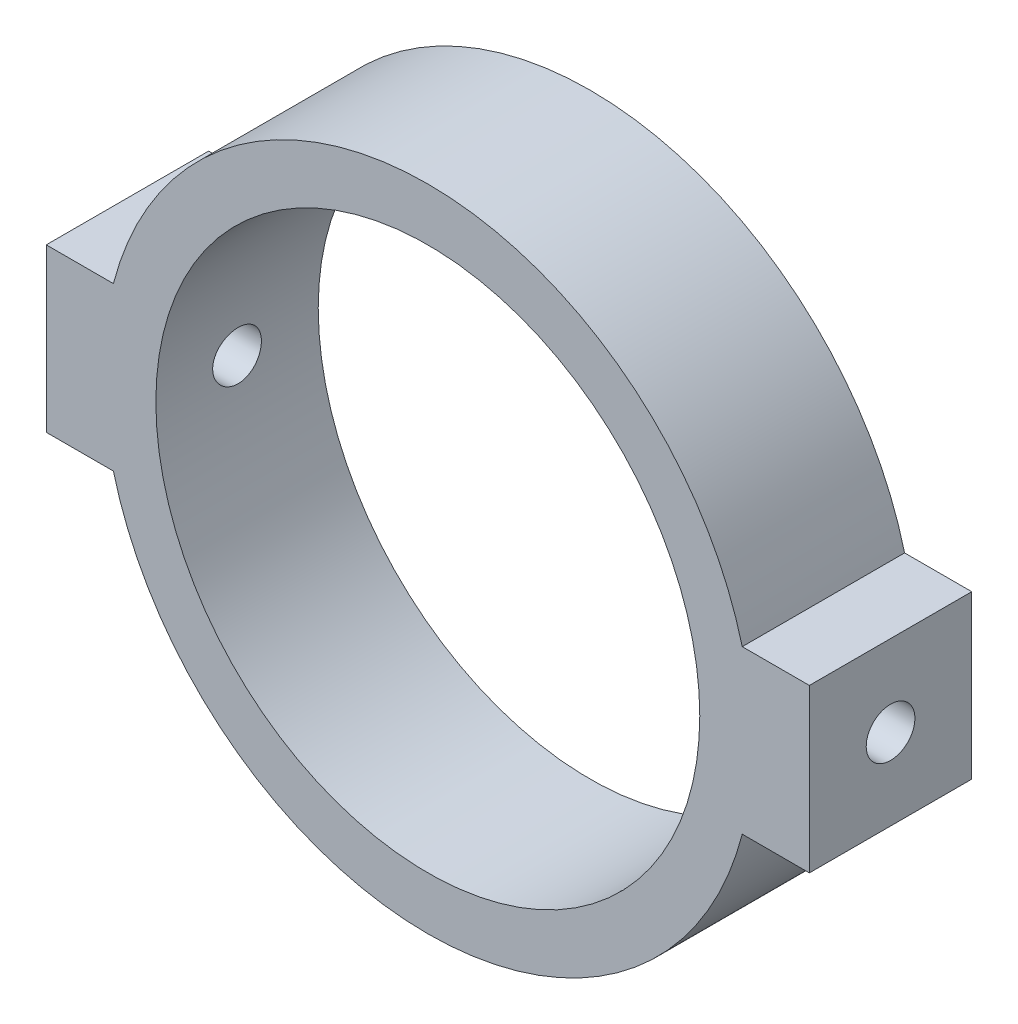
ISO-10303-21;
HEADER;
FILE_DESCRIPTION(('STEP AP214'),'2;1');
FILE_NAME('part.step','',(''),(''),'','','');
FILE_SCHEMA(('AUTOMOTIVE_DESIGN { 1 0 10303 214 1 1 1 1 }'));
ENDSEC;
DATA;
#1=APPLICATION_CONTEXT('core data for automotive mechanical design processes');
#2=APPLICATION_PROTOCOL_DEFINITION('international standard','automotive_design',2000,#1);
#3=PRODUCT_CONTEXT('',#1,'mechanical');
#4=PRODUCT('Part','Part','',(#3));
#5=PRODUCT_RELATED_PRODUCT_CATEGORY('part','',(#4));
#6=PRODUCT_DEFINITION_FORMATION('','',#4);
#7=PRODUCT_DEFINITION_CONTEXT('part definition',#1,'design');
#8=PRODUCT_DEFINITION('design','',#6,#7);
#9=PRODUCT_DEFINITION_SHAPE('','',#8);
#10=(LENGTH_UNIT() NAMED_UNIT(*) SI_UNIT(.MILLI.,.METRE.));
#11=(NAMED_UNIT(*) PLANE_ANGLE_UNIT() SI_UNIT($,.RADIAN.));
#12=(NAMED_UNIT(*) SI_UNIT($,.STERADIAN.) SOLID_ANGLE_UNIT());
#13=UNCERTAINTY_MEASURE_WITH_UNIT(LENGTH_MEASURE(1.E-05),#10,'distance_accuracy_value','');
#14=(GEOMETRIC_REPRESENTATION_CONTEXT(3) GLOBAL_UNCERTAINTY_ASSIGNED_CONTEXT((#13)) GLOBAL_UNIT_ASSIGNED_CONTEXT((#10,
#11,#12)) REPRESENTATION_CONTEXT('',''));
#15=CARTESIAN_POINT('',(0.,0.,0.));
#16=DIRECTION('',(0.,0.,1.));
#17=DIRECTION('',(1.,0.,0.));
#18=AXIS2_PLACEMENT_3D('',#15,#16,#17);
#19=CARTESIAN_POINT('',(0.,0.,10.));
#20=DIRECTION('',(0.,0.,1.));
#21=DIRECTION('',(1.,0.,0.));
#22=AXIS2_PLACEMENT_3D('',#19,#20,#21);
#23=PLANE('',#22);
#24=CARTESIAN_POINT('',(0.,0.,10.));
#25=DIRECTION('',(0.,0.,1.));
#26=DIRECTION('',(1.,0.,0.));
#27=AXIS2_PLACEMENT_3D('',#24,#25,#26);
#28=CIRCLE('',#27,20.);
#29=CARTESIAN_POINT('',(-19.3649167310371,-5.00000000000002,10.));
#30=VERTEX_POINT('',#29);
#31=CARTESIAN_POINT('',(19.3649167310371,-5.00000000000002,10.));
#32=VERTEX_POINT('',#31);
#33=EDGE_CURVE('E151',#30,#32,#28,.T.);
#34=ORIENTED_EDGE('',*,*,#33,.T.);
#35=DIRECTION('',(1.,0.,0.));
#36=VECTOR('',#35,1.);
#37=CARTESIAN_POINT('',(19.3649167310371,-5.00000000000002,10.));
#38=LINE('',#37,#36);
#39=CARTESIAN_POINT('',(23.5,-5.00000000000002,10.));
#40=VERTEX_POINT('',#39);
#41=EDGE_CURVE('E99',#32,#40,#38,.T.);
#42=ORIENTED_EDGE('',*,*,#41,.T.);
#43=DIRECTION('',(0.,1.,0.));
#44=VECTOR('',#43,1.);
#45=CARTESIAN_POINT('',(23.5,-5.00000000000002,10.));
#46=LINE('',#45,#44);
#47=CARTESIAN_POINT('',(23.5,4.99999999999999,10.));
#48=VERTEX_POINT('',#47);
#49=EDGE_CURVE('E224',#40,#48,#46,.T.);
#50=ORIENTED_EDGE('',*,*,#49,.T.);
#51=DIRECTION('',(-1.,0.,0.));
#52=VECTOR('',#51,1.);
#53=CARTESIAN_POINT('',(23.5,4.99999999999999,10.));
#54=LINE('',#53,#52);
#55=CARTESIAN_POINT('',(19.3649167310371,4.99999999999999,10.));
#56=VERTEX_POINT('',#55);
#57=EDGE_CURVE('E230',#48,#56,#54,.T.);
#58=ORIENTED_EDGE('',*,*,#57,.T.);
#59=CARTESIAN_POINT('',(0.,0.,10.));
#60=DIRECTION('',(0.,0.,1.));
#61=DIRECTION('',(1.,0.,0.));
#62=AXIS2_PLACEMENT_3D('',#59,#60,#61);
#63=CIRCLE('',#62,20.);
#64=CARTESIAN_POINT('',(-19.3649167310371,4.99999999999999,10.));
#65=VERTEX_POINT('',#64);
#66=EDGE_CURVE('E118',#56,#65,#63,.T.);
#67=ORIENTED_EDGE('',*,*,#66,.T.);
#68=DIRECTION('',(-1.,0.,0.));
#69=VECTOR('',#68,1.);
#70=CARTESIAN_POINT('',(-19.3649167310371,4.99999999999999,10.));
#71=LINE('',#70,#69);
#72=CARTESIAN_POINT('',(-23.5,4.99999999999999,10.));
#73=VERTEX_POINT('',#72);
#74=EDGE_CURVE('E112',#65,#73,#71,.T.);
#75=ORIENTED_EDGE('',*,*,#74,.T.);
#76=DIRECTION('',(0.,-1.,0.));
#77=VECTOR('',#76,1.);
#78=CARTESIAN_POINT('',(-23.5,4.99999999999999,10.));
#79=LINE('',#78,#77);
#80=CARTESIAN_POINT('',(-23.5,-5.00000000000002,10.));
#81=VERTEX_POINT('',#80);
#82=EDGE_CURVE('E116',#73,#81,#79,.T.);
#83=ORIENTED_EDGE('',*,*,#82,.T.);
#84=DIRECTION('',(1.,0.,0.));
#85=VECTOR('',#84,1.);
#86=CARTESIAN_POINT('',(-23.5,-5.00000000000002,10.));
#87=LINE('',#86,#85);
#88=EDGE_CURVE('E56',#81,#30,#87,.T.);
#89=ORIENTED_EDGE('',*,*,#88,.T.);
#90=EDGE_LOOP('',(#34,#42,#50,#58,#67,#75,#83,#89));
#91=FACE_BOUND('',#90,.T.);
#92=CARTESIAN_POINT('',(0.,0.,10.));
#93=DIRECTION('',(0.,0.,1.));
#94=DIRECTION('',(1.,0.,0.));
#95=AXIS2_PLACEMENT_3D('',#92,#93,#94);
#96=CIRCLE('',#95,16.75);
#97=CARTESIAN_POINT('',(16.75,0.,10.));
#98=VERTEX_POINT('',#97);
#99=EDGE_CURVE('E140',#98,#98,#96,.T.);
#100=ORIENTED_EDGE('',*,*,#99,.F.);
#101=EDGE_LOOP('',(#100));
#102=FACE_BOUND('',#101,.T.);
#103=ADVANCED_FACE('F33',(#91,#102),#23,.T.);
#104=CARTESIAN_POINT('',(0.,0.,0.));
#105=DIRECTION('',(0.,0.,1.));
#106=DIRECTION('',(1.,0.,0.));
#107=AXIS2_PLACEMENT_3D('',#104,#105,#106);
#108=PLANE('',#107);
#109=CARTESIAN_POINT('',(0.,0.,0.));
#110=DIRECTION('',(0.,0.,1.));
#111=DIRECTION('',(1.,0.,0.));
#112=AXIS2_PLACEMENT_3D('',#109,#110,#111);
#113=CIRCLE('',#112,20.);
#114=CARTESIAN_POINT('',(-19.3649167310371,-5.00000000000002,0.));
#115=VERTEX_POINT('',#114);
#116=CARTESIAN_POINT('',(19.3649167310371,-5.00000000000002,0.));
#117=VERTEX_POINT('',#116);
#118=EDGE_CURVE('E136',#115,#117,#113,.T.);
#119=ORIENTED_EDGE('',*,*,#118,.F.);
#120=DIRECTION('',(1.,0.,0.));
#121=VECTOR('',#120,1.);
#122=CARTESIAN_POINT('',(-23.5,-5.00000000000002,0.));
#123=LINE('',#122,#121);
#124=CARTESIAN_POINT('',(-23.5,-5.00000000000002,0.));
#125=VERTEX_POINT('',#124);
#126=EDGE_CURVE('E91',#125,#115,#123,.T.);
#127=ORIENTED_EDGE('',*,*,#126,.F.);
#128=DIRECTION('',(0.,-1.,0.));
#129=VECTOR('',#128,1.);
#130=CARTESIAN_POINT('',(-23.5,4.99999999999999,0.));
#131=LINE('',#130,#129);
#132=CARTESIAN_POINT('',(-23.5,4.99999999999999,0.));
#133=VERTEX_POINT('',#132);
#134=EDGE_CURVE('E85',#133,#125,#131,.T.);
#135=ORIENTED_EDGE('',*,*,#134,.F.);
#136=DIRECTION('',(-1.,0.,0.));
#137=VECTOR('',#136,1.);
#138=CARTESIAN_POINT('',(-19.3649167310371,4.99999999999999,0.));
#139=LINE('',#138,#137);
#140=CARTESIAN_POINT('',(-19.3649167310371,4.99999999999999,0.));
#141=VERTEX_POINT('',#140);
#142=EDGE_CURVE('E126',#141,#133,#139,.T.);
#143=ORIENTED_EDGE('',*,*,#142,.F.);
#144=CARTESIAN_POINT('',(0.,0.,0.));
#145=DIRECTION('',(0.,0.,1.));
#146=DIRECTION('',(1.,0.,0.));
#147=AXIS2_PLACEMENT_3D('',#144,#145,#146);
#148=CIRCLE('',#147,20.);
#149=CARTESIAN_POINT('',(19.3649167310371,4.99999999999999,0.));
#150=VERTEX_POINT('',#149);
#151=EDGE_CURVE('E146',#150,#141,#148,.T.);
#152=ORIENTED_EDGE('',*,*,#151,.F.);
#153=DIRECTION('',(-1.,0.,0.));
#154=VECTOR('',#153,1.);
#155=CARTESIAN_POINT('',(23.5,4.99999999999999,0.));
#156=LINE('',#155,#154);
#157=CARTESIAN_POINT('',(23.5,4.99999999999999,0.));
#158=VERTEX_POINT('',#157);
#159=EDGE_CURVE('E144',#158,#150,#156,.T.);
#160=ORIENTED_EDGE('',*,*,#159,.F.);
#161=DIRECTION('',(0.,1.,0.));
#162=VECTOR('',#161,1.);
#163=CARTESIAN_POINT('',(23.5,-5.00000000000002,0.));
#164=LINE('',#163,#162);
#165=CARTESIAN_POINT('',(23.5,-5.00000000000002,0.));
#166=VERTEX_POINT('',#165);
#167=EDGE_CURVE('E142',#166,#158,#164,.T.);
#168=ORIENTED_EDGE('',*,*,#167,.F.);
#169=DIRECTION('',(1.,0.,0.));
#170=VECTOR('',#169,1.);
#171=CARTESIAN_POINT('',(19.3649167310371,-5.00000000000002,0.));
#172=LINE('',#171,#170);
#173=EDGE_CURVE('E139',#117,#166,#172,.T.);
#174=ORIENTED_EDGE('',*,*,#173,.F.);
#175=EDGE_LOOP('',(#119,#127,#135,#143,#152,#160,#168,#174));
#176=FACE_BOUND('',#175,.T.);
#177=CARTESIAN_POINT('',(0.,0.,0.));
#178=DIRECTION('',(0.,0.,1.));
#179=DIRECTION('',(1.,0.,0.));
#180=AXIS2_PLACEMENT_3D('',#177,#178,#179);
#181=CIRCLE('',#180,16.75);
#182=CARTESIAN_POINT('',(16.75,0.,0.));
#183=VERTEX_POINT('',#182);
#184=EDGE_CURVE('E236',#183,#183,#181,.T.);
#185=ORIENTED_EDGE('',*,*,#184,.T.);
#186=EDGE_LOOP('',(#185));
#187=FACE_BOUND('',#186,.T.);
#188=ADVANCED_FACE('F186',(#176,#187),#108,.F.);
#189=CARTESIAN_POINT('',(0.,0.,10.));
#190=DIRECTION('',(0.,0.,-1.));
#191=DIRECTION('',(-1.,0.,0.));
#192=AXIS2_PLACEMENT_3D('',#189,#190,#191);
#193=CYLINDRICAL_SURFACE('',#192,20.);
#194=ORIENTED_EDGE('',*,*,#118,.T.);
#195=DIRECTION('',(0.,0.,-1.));
#196=VECTOR('',#195,1.);
#197=CARTESIAN_POINT('',(19.3649167310371,-5.00000000000002,10.));
#198=LINE('',#197,#196);
#199=EDGE_CURVE('E11',#32,#117,#198,.T.);
#200=ORIENTED_EDGE('',*,*,#199,.F.);
#201=ORIENTED_EDGE('',*,*,#33,.F.);
#202=DIRECTION('',(0.,0.,-1.));
#203=VECTOR('',#202,1.);
#204=CARTESIAN_POINT('',(-19.3649167310371,-5.00000000000002,10.));
#205=LINE('',#204,#203);
#206=EDGE_CURVE('E132',#30,#115,#205,.T.);
#207=ORIENTED_EDGE('',*,*,#206,.T.);
#208=EDGE_LOOP('',(#194,#200,#201,#207));
#209=FACE_BOUND('',#208,.T.);
#210=ADVANCED_FACE('F35',(#209),#193,.T.);
#211=CARTESIAN_POINT('',(19.3649167310371,-5.00000000000002,10.));
#212=DIRECTION('',(0.,1.,0.));
#213=DIRECTION('',(0.,0.,1.));
#214=AXIS2_PLACEMENT_3D('',#211,#212,#213);
#215=PLANE('',#214);
#216=ORIENTED_EDGE('',*,*,#173,.T.);
#217=DIRECTION('',(0.,0.,-1.));
#218=VECTOR('',#217,1.);
#219=CARTESIAN_POINT('',(23.5,-5.00000000000002,10.));
#220=LINE('',#219,#218);
#221=EDGE_CURVE('E47',#40,#166,#220,.T.);
#222=ORIENTED_EDGE('',*,*,#221,.F.);
#223=ORIENTED_EDGE('',*,*,#41,.F.);
#224=ORIENTED_EDGE('',*,*,#199,.T.);
#225=EDGE_LOOP('',(#216,#222,#223,#224));
#226=FACE_BOUND('',#225,.T.);
#227=ADVANCED_FACE('F210',(#226),#215,.F.);
#228=CARTESIAN_POINT('',(23.5,-5.00000000000002,10.));
#229=DIRECTION('',(-1.,0.,0.));
#230=DIRECTION('',(0.,-1.,0.));
#231=AXIS2_PLACEMENT_3D('',#228,#229,#230);
#232=PLANE('',#231);
#233=CARTESIAN_POINT('',(23.5,0.,5.));
#234=DIRECTION('',(1.,0.,0.));
#235=DIRECTION('',(0.,1.,0.));
#236=AXIS2_PLACEMENT_3D('',#233,#234,#235);
#237=CIRCLE('',#236,1.5);
#238=CARTESIAN_POINT('',(23.5,1.49999999999999,5.));
#239=VERTEX_POINT('',#238);
#240=EDGE_CURVE('E166',#239,#239,#237,.T.);
#241=ORIENTED_EDGE('',*,*,#240,.F.);
#242=EDGE_LOOP('',(#241));
#243=FACE_BOUND('',#242,.T.);
#244=ORIENTED_EDGE('',*,*,#167,.T.);
#245=DIRECTION('',(0.,0.,-1.));
#246=VECTOR('',#245,1.);
#247=CARTESIAN_POINT('',(23.5,4.99999999999999,10.));
#248=LINE('',#247,#246);
#249=EDGE_CURVE('E158',#48,#158,#248,.T.);
#250=ORIENTED_EDGE('',*,*,#249,.F.);
#251=ORIENTED_EDGE('',*,*,#49,.F.);
#252=ORIENTED_EDGE('',*,*,#221,.T.);
#253=EDGE_LOOP('',(#244,#250,#251,#252));
#254=FACE_BOUND('',#253,.T.);
#255=ADVANCED_FACE('F207',(#243,#254),#232,.F.);
#256=CARTESIAN_POINT('',(23.5,4.99999999999999,10.));
#257=DIRECTION('',(0.,-1.,0.));
#258=DIRECTION('',(0.,0.,-1.));
#259=AXIS2_PLACEMENT_3D('',#256,#257,#258);
#260=PLANE('',#259);
#261=ORIENTED_EDGE('',*,*,#159,.T.);
#262=DIRECTION('',(0.,0.,-1.));
#263=VECTOR('',#262,1.);
#264=CARTESIAN_POINT('',(19.3649167310371,4.99999999999999,10.));
#265=LINE('',#264,#263);
#266=EDGE_CURVE('E155',#56,#150,#265,.T.);
#267=ORIENTED_EDGE('',*,*,#266,.F.);
#268=ORIENTED_EDGE('',*,*,#57,.F.);
#269=ORIENTED_EDGE('',*,*,#249,.T.);
#270=EDGE_LOOP('',(#261,#267,#268,#269));
#271=FACE_BOUND('',#270,.T.);
#272=ADVANCED_FACE('F203',(#271),#260,.F.);
#273=CARTESIAN_POINT('',(0.,0.,10.));
#274=DIRECTION('',(0.,0.,-1.));
#275=DIRECTION('',(-1.,0.,0.));
#276=AXIS2_PLACEMENT_3D('',#273,#274,#275);
#277=CYLINDRICAL_SURFACE('',#276,20.);
#278=ORIENTED_EDGE('',*,*,#151,.T.);
#279=DIRECTION('',(0.,0.,-1.));
#280=VECTOR('',#279,1.);
#281=CARTESIAN_POINT('',(-19.3649167310371,4.99999999999999,10.));
#282=LINE('',#281,#280);
#283=EDGE_CURVE('E127',#65,#141,#282,.T.);
#284=ORIENTED_EDGE('',*,*,#283,.F.);
#285=ORIENTED_EDGE('',*,*,#66,.F.);
#286=ORIENTED_EDGE('',*,*,#266,.T.);
#287=EDGE_LOOP('',(#278,#284,#285,#286));
#288=FACE_BOUND('',#287,.T.);
#289=ADVANCED_FACE('F200',(#288),#277,.T.);
#290=CARTESIAN_POINT('',(-19.3649167310371,4.99999999999999,10.));
#291=DIRECTION('',(0.,-1.,0.));
#292=DIRECTION('',(1.,0.,0.));
#293=AXIS2_PLACEMENT_3D('',#290,#291,#292);
#294=PLANE('',#293);
#295=ORIENTED_EDGE('',*,*,#142,.T.);
#296=DIRECTION('',(0.,0.,-1.));
#297=VECTOR('',#296,1.);
#298=CARTESIAN_POINT('',(-23.5,4.99999999999999,10.));
#299=LINE('',#298,#297);
#300=EDGE_CURVE('E123',#73,#133,#299,.T.);
#301=ORIENTED_EDGE('',*,*,#300,.F.);
#302=ORIENTED_EDGE('',*,*,#74,.F.);
#303=ORIENTED_EDGE('',*,*,#283,.T.);
#304=EDGE_LOOP('',(#295,#301,#302,#303));
#305=FACE_BOUND('',#304,.T.);
#306=ADVANCED_FACE('F124',(#305),#294,.F.);
#307=CARTESIAN_POINT('',(-23.5,4.99999999999999,10.));
#308=DIRECTION('',(1.,0.,0.));
#309=DIRECTION('',(0.,0.,-1.));
#310=AXIS2_PLACEMENT_3D('',#307,#308,#309);
#311=PLANE('',#310);
#312=CARTESIAN_POINT('',(-23.5,0.,5.));
#313=DIRECTION('',(1.,0.,0.));
#314=DIRECTION('',(0.,0.,-1.));
#315=AXIS2_PLACEMENT_3D('',#312,#313,#314);
#316=CIRCLE('',#315,1.5);
#317=CARTESIAN_POINT('',(-23.5,0.,3.5));
#318=VERTEX_POINT('',#317);
#319=EDGE_CURVE('E239',#318,#318,#316,.T.);
#320=ORIENTED_EDGE('',*,*,#319,.T.);
#321=EDGE_LOOP('',(#320));
#322=FACE_BOUND('',#321,.T.);
#323=ORIENTED_EDGE('',*,*,#134,.T.);
#324=DIRECTION('',(0.,0.,-1.));
#325=VECTOR('',#324,1.);
#326=CARTESIAN_POINT('',(-23.5,-5.00000000000002,10.));
#327=LINE('',#326,#325);
#328=EDGE_CURVE('E128',#81,#125,#327,.T.);
#329=ORIENTED_EDGE('',*,*,#328,.F.);
#330=ORIENTED_EDGE('',*,*,#82,.F.);
#331=ORIENTED_EDGE('',*,*,#300,.T.);
#332=EDGE_LOOP('',(#323,#329,#330,#331));
#333=FACE_BOUND('',#332,.T.);
#334=ADVANCED_FACE('F130',(#322,#333),#311,.F.);
#335=CARTESIAN_POINT('',(-23.5,-5.00000000000002,10.));
#336=DIRECTION('',(0.,1.,0.));
#337=DIRECTION('',(0.,0.,1.));
#338=AXIS2_PLACEMENT_3D('',#335,#336,#337);
#339=PLANE('',#338);
#340=ORIENTED_EDGE('',*,*,#126,.T.);
#341=ORIENTED_EDGE('',*,*,#206,.F.);
#342=ORIENTED_EDGE('',*,*,#88,.F.);
#343=ORIENTED_EDGE('',*,*,#328,.T.);
#344=EDGE_LOOP('',(#340,#341,#342,#343));
#345=FACE_BOUND('',#344,.T.);
#346=ADVANCED_FACE('F182',(#345),#339,.F.);
#347=CARTESIAN_POINT('',(0.,0.,10.));
#348=DIRECTION('',(0.,0.,-1.));
#349=DIRECTION('',(-1.,0.,0.));
#350=AXIS2_PLACEMENT_3D('',#347,#348,#349);
#351=CYLINDRICAL_SURFACE('',#350,16.75);
#352=CARTESIAN_POINT('',(-16.75,0.,6.5));
#353=CARTESIAN_POINT('',(-16.7499991248293,-0.0840749766629218,6.49999633838947));
#354=CARTESIAN_POINT('',(-16.749360250413,-0.168206608332003,6.49290761378101));
#355=CARTESIAN_POINT('',(-16.7468730820658,-0.334140463483675,6.46473459665416));
#356=CARTESIAN_POINT('',(-16.7450234312601,-0.4159399659775,6.44363460181194));
#357=CARTESIAN_POINT('',(-16.7403236497799,-0.574782428579868,6.38805555471489));
#358=CARTESIAN_POINT('',(-16.7374740987536,-0.651828114142581,6.35358425266891));
#359=CARTESIAN_POINT('',(-16.7310937501497,-0.799022029822292,6.2722553958048));
#360=CARTESIAN_POINT('',(-16.7275630947166,-0.869171694513856,6.22540042466572));
#361=CARTESIAN_POINT('',(-16.7202049570502,-1.00080488921376,6.12048696000672));
#362=CARTESIAN_POINT('',(-16.7163767294629,-1.06226549504313,6.06239975357323));
#363=CARTESIAN_POINT('',(-16.7088611340699,-1.17457910724569,5.93673161410646));
#364=CARTESIAN_POINT('',(-16.705173772571,-1.22543163914298,5.86915025664675));
#365=CARTESIAN_POINT('',(-16.6983495557452,-1.31516460713752,5.72627154734838));
#366=CARTESIAN_POINT('',(-16.695213641485,-1.35402466127637,5.65096134610817));
#367=CARTESIAN_POINT('',(-16.6898562026414,-1.41853940674791,5.49485211546163));
#368=CARTESIAN_POINT('',(-16.6876346596506,-1.44419436391814,5.41405319658813));
#369=CARTESIAN_POINT('',(-16.6843639538893,-1.48150359047664,5.24949147544076));
#370=CARTESIAN_POINT('',(-16.6833116413642,-1.49319548094458,5.16573726620858));
#371=CARTESIAN_POINT('',(-16.682488660831,-1.50236293232062,4.99744910800129));
#372=CARTESIAN_POINT('',(-16.6827179653846,-1.49983879757909,4.91291517575792));
#373=CARTESIAN_POINT('',(-16.6844294422903,-1.48067691095549,4.74572552779841));
#374=CARTESIAN_POINT('',(-16.6859079791809,-1.46408011222896,4.66306507594524));
#375=CARTESIAN_POINT('',(-16.6899456339685,-1.41730767909601,4.5017077717132));
#376=CARTESIAN_POINT('',(-16.6925047638486,-1.38713189410637,4.42301096329965));
#377=CARTESIAN_POINT('',(-16.6984194409388,-1.31401244366685,4.2716847497669));
#378=CARTESIAN_POINT('',(-16.7017761283562,-1.27105047636628,4.19906423431017));
#379=CARTESIAN_POINT('',(-16.7089066877734,-1.17359137182372,4.06204927310479));
#380=CARTESIAN_POINT('',(-16.7126805695469,-1.11909396431143,3.99765502015054));
#381=CARTESIAN_POINT('',(-16.7202364812265,-0.99988160428734,3.87868242985459));
#382=CARTESIAN_POINT('',(-16.7240184928641,-0.935131260029798,3.82413954813303));
#383=CARTESIAN_POINT('',(-16.731151876175,-0.797374319129201,3.7266923444919));
#384=CARTESIAN_POINT('',(-16.7345032474984,-0.724367715779197,3.68378803202699));
#385=CARTESIAN_POINT('',(-16.7403985361028,-0.572147064931542,3.61083779358294));
#386=CARTESIAN_POINT('',(-16.7429423497106,-0.49293222205505,3.58079351838522));
#387=CARTESIAN_POINT('',(-16.7469347684056,-0.330554641594469,3.53444143305094));
#388=CARTESIAN_POINT('',(-16.7483833997457,-0.247391998694928,3.51813329364079));
#389=CARTESIAN_POINT('',(-16.7500188632906,-0.079786725828824,3.49976104654108));
#390=CARTESIAN_POINT('',(-16.7502100322484,0.00465049717152357,3.49764798215034));
#391=CARTESIAN_POINT('',(-16.7493206304524,0.172677951741549,3.50759750016232));
#392=CARTESIAN_POINT('',(-16.7482400734277,0.256268192445022,3.51965992953312));
#393=CARTESIAN_POINT('',(-16.7449314903694,0.420088667953069,3.55757743629397));
#394=CARTESIAN_POINT('',(-16.7427053591589,0.500324215327008,3.58340974031295));
#395=CARTESIAN_POINT('',(-16.7373555835254,0.655322476307776,3.64811040169175));
#396=CARTESIAN_POINT('',(-16.7342319228002,0.730085090475959,3.68697899583853));
#397=CARTESIAN_POINT('',(-16.727426169439,0.872237534770043,3.77677136023608));
#398=CARTESIAN_POINT('',(-16.7237425884624,0.939606865310208,3.82772746929397));
#399=CARTESIAN_POINT('',(-16.7162355767145,1.06485324079504,3.94020181429867));
#400=CARTESIAN_POINT('',(-16.7124121431368,1.12273009513406,4.00172026228284));
#401=CARTESIAN_POINT('',(-16.7050434367452,1.2275172613647,4.13378585993272));
#402=CARTESIAN_POINT('',(-16.7014989953786,1.2743955610858,4.20435846244501));
#403=CARTESIAN_POINT('',(-16.695101701411,1.35563521956819,4.35240278640602));
#404=CARTESIAN_POINT('',(-16.692248840995,1.38999671977509,4.42987442988008));
#405=CARTESIAN_POINT('',(-16.6875625967139,1.44517318146677,4.5894056069173));
#406=CARTESIAN_POINT('',(-16.6857277532069,1.46600754562097,4.67145838511282));
#407=CARTESIAN_POINT('',(-16.683280544563,1.49360142112888,4.83791470576968));
#408=CARTESIAN_POINT('',(-16.682668151894,1.50036124946827,4.92231819524509));
#409=CARTESIAN_POINT('',(-16.6827356521121,1.49961025013878,5.09076189107996));
#410=CARTESIAN_POINT('',(-16.6834109906811,1.49214971565074,5.17480232805269));
#411=CARTESIAN_POINT('',(-16.6859681717601,1.46327484331685,5.34043128522549));
#412=CARTESIAN_POINT('',(-16.6878500159556,1.4418604859784,5.42201980200022));
#413=CARTESIAN_POINT('',(-16.6926069516694,1.38569899765275,5.58043087834929));
#414=CARTESIAN_POINT('',(-16.6954819602062,1.35095298053518,5.65725383546675));
#415=CARTESIAN_POINT('',(-16.7019014400605,1.26911992435462,5.8039846710953));
#416=CARTESIAN_POINT('',(-16.7054459032615,1.22203303491158,5.87389263342919));
#417=CARTESIAN_POINT('',(-16.7128198790307,1.11666576633635,6.00506665286951));
#418=CARTESIAN_POINT('',(-16.7166503159495,1.05834803378671,6.06630265360185));
#419=CARTESIAN_POINT('',(-16.7241561835038,0.932245009034498,6.17814367852339));
#420=CARTESIAN_POINT('',(-16.7278315765476,0.864457437773356,6.22874613622793));
#421=CARTESIAN_POINT('',(-16.7346208994889,0.72118889610731,6.31796267054513));
#422=CARTESIAN_POINT('',(-16.7377336403505,0.645692148724432,6.35655148048607));
#423=CARTESIAN_POINT('',(-16.7430334165078,0.489313289022549,6.42045458415933));
#424=CARTESIAN_POINT('',(-16.7452215081889,0.408437445152673,6.44578403428006));
#425=CARTESIAN_POINT('',(-16.7478679131015,0.272575948139865,6.47604585761058));
#426=CARTESIAN_POINT('',(-16.7486637748496,0.21846226724398,6.48501660468641));
#427=CARTESIAN_POINT('',(-16.7497301026835,0.109573745668468,6.49699485978395));
#428=CARTESIAN_POINT('',(-16.7500005704242,0.0547989070717358,6.50000238658711));
#429=CARTESIAN_POINT('',(-16.75,0.,6.5));
#430=B_SPLINE_CURVE_WITH_KNOTS('',3,(#352,#353,#354,#355,#356,#357,#358,#359,#360,#361,#362,
#363,#364,#365,#366,#367,#368,#369,#370,#371,#372,#373,#374,#375,#376,#377,#378,#379,#380,#381,
#382,#383,#384,#385,#386,#387,#388,#389,#390,#391,#392,#393,#394,#395,#396,#397,#398,#399,#400,
#401,#402,#403,#404,#405,#406,#407,#408,#409,#410,#411,#412,#413,#414,#415,#416,#417,#418,#419,
#420,#421,#422,#423,#424,#425,#426,#427,#428,#429),.UNSPECIFIED.,.T.,.F.,(4,2,2,2,2,2,2,2,2,2,2,
2,2,2,2,2,2,2,2,2,2,2,2,2,2,2,2,2,2,2,2,2,2,2,2,2,2,2,4),(0.,0.252024843921749,
0.504332607917487,0.756494348570912,1.00860352068372,1.26136588782703,1.51413955805441,
1.76734049647419,2.02053633739646,2.27304843543953,2.52555512748086,2.77732950654489,
3.02910667771202,3.28124598461202,3.53339119967912,3.78642656168603,4.03946212924704,
4.29253016803853,4.54559214027699,4.79778088934431,5.04996691592606,5.3017371516639,
5.55351196072284,5.80596811733725,6.05842934256352,6.31161650491537,6.56480080604659,
6.81762114486388,7.07043578961855,7.32235796315075,7.57428048860301,7.82618197033149,
8.07808039816372,8.33083157136473,8.58364367805132,8.83698395312934,9.09003400645709,
9.25430083170825,9.41856713959207),.UNSPECIFIED.);
#431=CARTESIAN_POINT('',(-16.75,0.,6.5));
#432=VERTEX_POINT('',#431);
#433=EDGE_CURVE('E37',#432,#432,#430,.T.);
#434=ORIENTED_EDGE('',*,*,#433,.F.);
#435=EDGE_LOOP('',(#434));
#436=FACE_BOUND('',#435,.T.);
#437=CARTESIAN_POINT('',(16.6827006207029,1.49999999999999,5.));
#438=CARTESIAN_POINT('',(16.6827015090268,1.49999633770452,4.91592578552345));
#439=CARTESIAN_POINT('',(16.6833430166231,1.4929077372777,4.83179491359238));
#440=CARTESIAN_POINT('',(16.6858395919208,1.4647352582583,4.66586263699657));
#441=CARTESIAN_POINT('',(16.6876960213975,1.44363567471961,4.58406395391692));
#442=CARTESIAN_POINT('',(16.6924105077263,1.3880578308557,4.42522322384418));
#443=CARTESIAN_POINT('',(16.6952679827817,1.35358734031205,4.34817844445802));
#444=CARTESIAN_POINT('',(16.7016618713002,1.27226039437857,4.20098604661648));
#445=CARTESIAN_POINT('',(16.7051981432062,1.22540652067028,4.1308369947205));
#446=CARTESIAN_POINT('',(16.7125628523382,1.12049416370052,3.99920310595085));
#447=CARTESIAN_POINT('',(16.716392028854,1.06240672243087,3.93774138785573));
#448=CARTESIAN_POINT('',(16.7239043483816,0.936737646565124,3.82542562956812));
#449=CARTESIAN_POINT('',(16.7275874849025,0.869155590574369,3.77457206044076));
#450=CARTESIAN_POINT('',(16.7343998613699,0.726276271335021,3.68483800946187));
#451=CARTESIAN_POINT('',(16.7375281635137,0.650966278791078,3.64597771861293));
#452=CARTESIAN_POINT('',(16.7428703984137,0.494857501801144,3.58146247791249));
#453=CARTESIAN_POINT('',(16.7450843493818,0.414058826715028,3.55580726504221));
#454=CARTESIAN_POINT('',(16.7483432538674,0.249497843396412,3.51849750173166));
#455=CARTESIAN_POINT('',(16.7493913498628,0.165744132826313,3.50680530868146));
#456=CARTESIAN_POINT('',(16.7502111165329,-0.00254304964411609,3.4976370793772));
#457=CARTESIAN_POINT('',(16.749982814242,-0.0870765049914347,3.50016074202846));
#458=CARTESIAN_POINT('',(16.7482780929818,-0.25426824002936,3.51932188311901));
#459=CARTESIAN_POINT('',(16.7468052536149,-0.336931200314688,3.53591888356807));
#460=CARTESIAN_POINT('',(16.7427811851427,-0.498293417328319,3.58269259037578));
#461=CARTESIAN_POINT('',(16.7402299444401,-0.576992631420001,3.61286944277344));
#462=CARTESIAN_POINT('',(16.7343298642579,-0.728321753772615,3.68599109944609));
#463=CARTESIAN_POINT('',(16.730979898422,-0.800942893606237,3.72895395587844));
#464=CARTESIAN_POINT('',(16.7238586329546,-0.937958726104964,3.82641495600571));
#465=CARTESIAN_POINT('',(16.720087323435,-1.00235322562859,3.88091337044766));
#466=CARTESIAN_POINT('',(16.7125313638788,-1.12132467144575,4.00012644232029));
#467=CARTESIAN_POINT('',(16.7087467134789,-1.17586636563525,4.06487628651974));
#468=CARTESIAN_POINT('',(16.7016039015737,-1.27331141188562,4.20263180466849));
#469=CARTESIAN_POINT('',(16.6982457405042,-1.31621475205325,4.27563748705434));
#470=CARTESIAN_POINT('',(16.6923356295515,-1.3891642919625,4.42785789348071));
#471=CARTESIAN_POINT('',(16.6897838020804,-1.41920853977073,4.5070735580017));
#472=CARTESIAN_POINT('',(16.6857777459523,-1.46556031831917,4.6694529236541));
#473=CARTESIAN_POINT('',(16.6843234905897,-1.48186818328762,4.75261652867375));
#474=CARTESIAN_POINT('',(16.6826816848058,-1.50023939599291,4.9202222410464));
#475=CARTESIAN_POINT('',(16.6824897579389,-1.50235195886313,5.00465891286126));
#476=CARTESIAN_POINT('',(16.6833827906303,-1.49240163456631,5.17268514439523));
#477=CARTESIAN_POINT('',(16.6844677364041,-1.48033890043046,5.25627471324952));
#478=CARTESIAN_POINT('',(16.6877882822532,-1.44242147974868,5.42009188769032));
#479=CARTESIAN_POINT('',(16.6900219570394,-1.41658986744016,5.50032487642329));
#480=CARTESIAN_POINT('',(16.6953867003509,-1.35189144690463,5.65531832635869));
#481=CARTESIAN_POINT('',(16.6985177854577,-1.31302439782011,5.73007868641153));
#482=CARTESIAN_POINT('',(16.7053351627767,-1.22323430072633,5.87222960695267));
#483=CARTESIAN_POINT('',(16.7090229522888,-1.17227852122185,5.93959941958237));
#484=CARTESIAN_POINT('',(16.7165332156884,-1.05980455658482,6.06484692137554));
#485=CARTESIAN_POINT('',(16.720355692249,-0.998286161741169,6.12272442203319));
#486=CARTESIAN_POINT('',(16.7277177308748,-0.86622027942156,6.22751296765923));
#487=CARTESIAN_POINT('',(16.7312564475571,-0.795647330162961,6.27439199052692));
#488=CARTESIAN_POINT('',(16.7376400239845,-0.647602121520909,6.35563291814214));
#489=CARTESIAN_POINT('',(16.7404848915798,-0.570129940208266,6.38999496450776));
#490=CARTESIAN_POINT('',(16.7451563677115,-0.410599116656548,6.44517179117156));
#491=CARTESIAN_POINT('',(16.7469844518474,-0.328547311991124,6.46600621073003));
#492=CARTESIAN_POINT('',(16.7494224008644,-0.16209304313602,6.49360052698641));
#493=CARTESIAN_POINT('',(16.750032292733,-0.0776906310628319,6.50036073547935));
#494=CARTESIAN_POINT('',(16.7499651615688,0.0907537309624247,6.49961083787839));
#495=CARTESIAN_POINT('',(16.7492926327919,0.174795909046581,6.49215056762617));
#496=CARTESIAN_POINT('',(16.7467451015021,0.340428414001304,6.46327561093763));
#497=CARTESIAN_POINT('',(16.7448700975755,0.422018737989109,6.44186090809509));
#498=CARTESIAN_POINT('',(16.7401278819407,0.580433410953264,6.38569805487743));
#499=CARTESIAN_POINT('',(16.7372607521734,0.657258152907423,6.35095100561217));
#500=CARTESIAN_POINT('',(16.7308546358007,0.80399212698182,6.2691153331512));
#501=CARTESIAN_POINT('',(16.7273156574477,0.873901444029319,6.22202686154451));
#502=CARTESIAN_POINT('',(16.7199480011976,1.00507536549321,6.1166578607431));
#503=CARTESIAN_POINT('',(16.7161183918587,1.06631020280046,6.05834033943702));
#504=CARTESIAN_POINT('',(16.7086090264097,1.17814897915344,5.9322382147685));
#505=CARTESIAN_POINT('',(16.7049293066924,1.22875034867768,5.86445132975696));
#506=CARTESIAN_POINT('',(16.6981279979496,1.31796572101423,5.72118333926337));
#507=CARTESIAN_POINT('',(16.6950076004194,1.35655425928474,5.64568633361103));
#508=CARTESIAN_POINT('',(16.689692633453,1.42045678335007,5.48930692447165));
#509=CARTESIAN_POINT('',(16.6874970072378,1.4457859293515,5.40843079106361));
#510=CARTESIAN_POINT('',(16.6848410077298,1.47604688966084,5.27257010879272));
#511=CARTESIAN_POINT('',(16.6840420894274,1.48501724839074,5.21845759321899));
#512=CARTESIAN_POINT('',(16.6829716072611,1.49699498753926,5.10957140666339));
#513=CARTESIAN_POINT('',(16.6827000417128,1.50000238700424,5.05479773779388));
#514=CARTESIAN_POINT('',(16.6827006207029,1.49999999999999,5.));
#515=B_SPLINE_CURVE_WITH_KNOTS('',3,(#437,#438,#439,#440,#441,#442,#443,#444,#445,#446,#447,
#448,#449,#450,#451,#452,#453,#454,#455,#456,#457,#458,#459,#460,#461,#462,#463,#464,#465,#466,
#467,#468,#469,#470,#471,#472,#473,#474,#475,#476,#477,#478,#479,#480,#481,#482,#483,#484,#485,
#486,#487,#488,#489,#490,#491,#492,#493,#494,#495,#496,#497,#498,#499,#500,#501,#502,#503,#504,
#505,#506,#507,#508,#509,#510,#511,#512,#513,#514),.UNSPECIFIED.,.T.,.F.,(4,2,2,2,2,2,2,2,2,2,2,
2,2,2,2,2,2,2,2,2,2,2,2,2,2,2,2,2,2,2,2,2,2,2,2,2,2,2,4),(0.,0.252022554591927,
0.504328079823719,0.756487210415178,1.00859381240819,1.26135917518274,1.51413575986021,
1.76733560804381,2.02053041279735,2.27304108292856,2.52554640485293,2.77732792025783,
3.02911214340964,3.28125355301079,3.53340088119072,3.78643322551287,4.03946582840801,
4.29253682653,4.54560166685038,4.79778867625387,5.04997296316606,5.30173595582577,
5.55350360060027,5.80596087308204,6.05842315845253,6.31161161132198,6.56479719950791,
6.81761438885339,7.07042597731802,7.3223532130854,7.57428074504409,7.82618747494791,
8.07809111084004,8.33083925315479,8.58364840067364,8.83698985481763,9.09004101330781,
9.25430433782848,9.41856713767331),.UNSPECIFIED.);
#516=CARTESIAN_POINT('',(16.6827006207029,1.49999999999999,5.));
#517=VERTEX_POINT('',#516);
#518=EDGE_CURVE('E162',#517,#517,#515,.T.);
#519=ORIENTED_EDGE('',*,*,#518,.F.);
#520=EDGE_LOOP('',(#519));
#521=FACE_BOUND('',#520,.T.);
#522=ORIENTED_EDGE('',*,*,#99,.T.);
#523=EDGE_LOOP('',(#522));
#524=FACE_BOUND('',#523,.T.);
#525=ORIENTED_EDGE('',*,*,#184,.F.);
#526=EDGE_LOOP('',(#525));
#527=FACE_BOUND('',#526,.T.);
#528=ADVANCED_FACE('F167',(#436,#521,#524,#527),#351,.F.);
#529=CARTESIAN_POINT('',(-43.5,0.,5.));
#530=DIRECTION('',(1.,0.,0.));
#531=DIRECTION('',(0.,1.,0.));
#532=AXIS2_PLACEMENT_3D('',#529,#530,#531);
#533=CYLINDRICAL_SURFACE('',#532,1.5);
#534=ORIENTED_EDGE('',*,*,#518,.T.);
#535=EDGE_LOOP('',(#534));
#536=FACE_BOUND('',#535,.T.);
#537=ORIENTED_EDGE('',*,*,#240,.T.);
#538=EDGE_LOOP('',(#537));
#539=FACE_BOUND('',#538,.T.);
#540=ADVANCED_FACE('F170',(#536,#539),#533,.F.);
#541=ORIENTED_EDGE('',*,*,#433,.T.);
#542=EDGE_LOOP('',(#541));
#543=FACE_BOUND('',#542,.T.);
#544=ORIENTED_EDGE('',*,*,#319,.F.);
#545=EDGE_LOOP('',(#544));
#546=FACE_BOUND('',#545,.T.);
#547=ADVANCED_FACE('F173',(#543,#546),#533,.F.);
#548=CLOSED_SHELL('',(#103,#188,#210,#227,#255,#272,#289,#306,#334,#346,#528,#540,#547));
#549=MANIFOLD_SOLID_BREP('B2',#548);
#550=ADVANCED_BREP_SHAPE_REPRESENTATION('',(#18,#549),#14);
#551=SHAPE_DEFINITION_REPRESENTATION(#9,#550);
ENDSEC;
END-ISO-10303-21;
